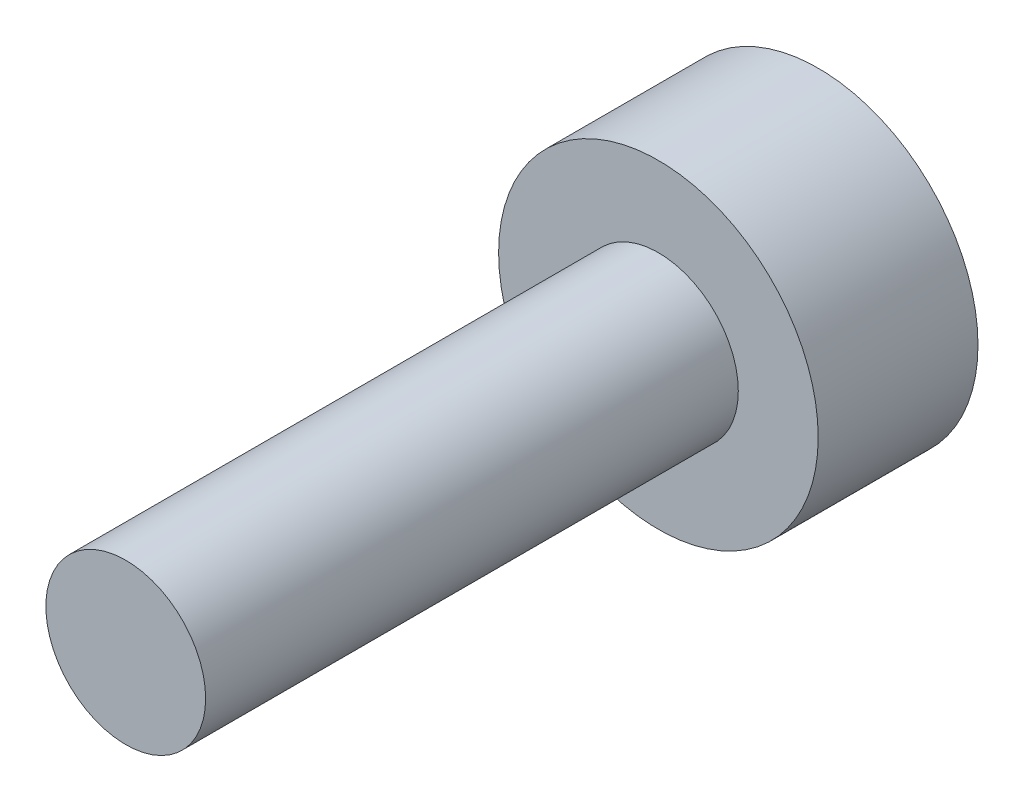
ISO-10303-21;
HEADER;
FILE_DESCRIPTION(('STEP AP214'),'2;1');
FILE_NAME('part.step','',(''),(''),'','','');
FILE_SCHEMA(('AUTOMOTIVE_DESIGN { 1 0 10303 214 1 1 1 1 }'));
ENDSEC;
DATA;
#1=APPLICATION_CONTEXT('core data for automotive mechanical design processes');
#2=APPLICATION_PROTOCOL_DEFINITION('international standard','automotive_design',2000,#1);
#3=PRODUCT_CONTEXT('',#1,'mechanical');
#4=PRODUCT('Part','Part','',(#3));
#5=PRODUCT_RELATED_PRODUCT_CATEGORY('part','',(#4));
#6=PRODUCT_DEFINITION_FORMATION('','',#4);
#7=PRODUCT_DEFINITION_CONTEXT('part definition',#1,'design');
#8=PRODUCT_DEFINITION('design','',#6,#7);
#9=PRODUCT_DEFINITION_SHAPE('','',#8);
#10=(LENGTH_UNIT() NAMED_UNIT(*) SI_UNIT(.MILLI.,.METRE.));
#11=(NAMED_UNIT(*) PLANE_ANGLE_UNIT() SI_UNIT($,.RADIAN.));
#12=(NAMED_UNIT(*) SI_UNIT($,.STERADIAN.) SOLID_ANGLE_UNIT());
#13=UNCERTAINTY_MEASURE_WITH_UNIT(LENGTH_MEASURE(1.E-05),#10,'distance_accuracy_value','');
#14=(GEOMETRIC_REPRESENTATION_CONTEXT(3) GLOBAL_UNCERTAINTY_ASSIGNED_CONTEXT((#13)) GLOBAL_UNIT_ASSIGNED_CONTEXT((#10,
#11,#12)) REPRESENTATION_CONTEXT('',''));
#15=CARTESIAN_POINT('',(0.,0.,0.));
#16=DIRECTION('',(0.,0.,1.));
#17=DIRECTION('',(1.,0.,0.));
#18=AXIS2_PLACEMENT_3D('',#15,#16,#17);
#19=CARTESIAN_POINT('',(-1.84950811302659,0.425595617246563,10.));
#20=DIRECTION('',(0.,0.,-1.));
#21=DIRECTION('',(-1.,0.,0.));
#22=AXIS2_PLACEMENT_3D('',#19,#20,#21);
#23=CYLINDRICAL_SURFACE('',#22,1.5);
#24=CARTESIAN_POINT('',(-1.84950811302659,0.425595617246563,10.));
#25=DIRECTION('',(0.,0.,1.));
#26=DIRECTION('',(1.,0.,0.));
#27=AXIS2_PLACEMENT_3D('',#24,#25,#26);
#28=CIRCLE('',#27,1.5);
#29=CARTESIAN_POINT('',(-0.349508113026588,0.425595617246563,10.));
#30=VERTEX_POINT('',#29);
#31=EDGE_CURVE('E10',#30,#30,#28,.T.);
#32=ORIENTED_EDGE('',*,*,#31,.F.);
#33=EDGE_LOOP('',(#32));
#34=FACE_BOUND('',#33,.T.);
#35=CARTESIAN_POINT('',(-1.84950811302659,0.425595617246563,0.));
#36=DIRECTION('',(0.,0.,1.));
#37=DIRECTION('',(1.,0.,0.));
#38=AXIS2_PLACEMENT_3D('',#35,#36,#37);
#39=CIRCLE('',#38,1.5);
#40=CARTESIAN_POINT('',(-0.349508113026588,0.425595617246563,0.));
#41=VERTEX_POINT('',#40);
#42=EDGE_CURVE('E44',#41,#41,#39,.T.);
#43=ORIENTED_EDGE('',*,*,#42,.T.);
#44=EDGE_LOOP('',(#43));
#45=FACE_BOUND('',#44,.T.);
#46=ADVANCED_FACE('F41',(#34,#45),#23,.T.);
#47=CARTESIAN_POINT('',(-1.84950811302659,0.425595617246563,10.));
#48=DIRECTION('',(0.,0.,1.));
#49=DIRECTION('',(1.,0.,0.));
#50=AXIS2_PLACEMENT_3D('',#47,#48,#49);
#51=PLANE('',#50);
#52=ORIENTED_EDGE('',*,*,#31,.T.);
#53=EDGE_LOOP('',(#52));
#54=FACE_BOUND('',#53,.T.);
#55=ADVANCED_FACE('F68',(#54),#51,.T.);
#56=CARTESIAN_POINT('',(-1.84950811302659,0.425595617246563,-3.));
#57=DIRECTION('',(0.,0.,1.));
#58=DIRECTION('',(1.,0.,0.));
#59=AXIS2_PLACEMENT_3D('',#56,#57,#58);
#60=CYLINDRICAL_SURFACE('',#59,3.);
#61=CARTESIAN_POINT('',(-1.84950811302659,0.425595617246563,-3.));
#62=DIRECTION('',(0.,0.,-1.));
#63=DIRECTION('',(-1.,0.,0.));
#64=AXIS2_PLACEMENT_3D('',#61,#62,#63);
#65=CIRCLE('',#64,3.);
#66=CARTESIAN_POINT('',(-4.84950811302659,0.425595617246563,-3.));
#67=VERTEX_POINT('',#66);
#68=EDGE_CURVE('E53',#67,#67,#65,.T.);
#69=ORIENTED_EDGE('',*,*,#68,.F.);
#70=EDGE_LOOP('',(#69));
#71=FACE_BOUND('',#70,.T.);
#72=CARTESIAN_POINT('',(-1.84950811302659,0.425595617246563,0.));
#73=DIRECTION('',(0.,0.,-1.));
#74=DIRECTION('',(-1.,0.,0.));
#75=AXIS2_PLACEMENT_3D('',#72,#73,#74);
#76=CIRCLE('',#75,3.);
#77=CARTESIAN_POINT('',(-4.84950811302659,0.425595617246563,0.));
#78=VERTEX_POINT('',#77);
#79=EDGE_CURVE('E55',#78,#78,#76,.T.);
#80=ORIENTED_EDGE('',*,*,#79,.T.);
#81=EDGE_LOOP('',(#80));
#82=FACE_BOUND('',#81,.T.);
#83=ADVANCED_FACE('F65',(#71,#82),#60,.T.);
#84=CARTESIAN_POINT('',(-1.84950811302659,0.425595617246563,-3.));
#85=DIRECTION('',(0.,0.,-1.));
#86=DIRECTION('',(-1.,0.,0.));
#87=AXIS2_PLACEMENT_3D('',#84,#85,#86);
#88=PLANE('',#87);
#89=ORIENTED_EDGE('',*,*,#68,.T.);
#90=EDGE_LOOP('',(#89));
#91=FACE_BOUND('',#90,.T.);
#92=ADVANCED_FACE('F63',(#91),#88,.T.);
#93=CARTESIAN_POINT('',(-1.84950811302659,0.425595617246563,0.));
#94=DIRECTION('',(0.,0.,-1.));
#95=DIRECTION('',(-1.,0.,0.));
#96=AXIS2_PLACEMENT_3D('',#93,#94,#95);
#97=PLANE('',#96);
#98=ORIENTED_EDGE('',*,*,#42,.F.);
#99=EDGE_LOOP('',(#98));
#100=FACE_BOUND('',#99,.T.);
#101=ORIENTED_EDGE('',*,*,#79,.F.);
#102=EDGE_LOOP('',(#101));
#103=FACE_BOUND('',#102,.T.);
#104=ADVANCED_FACE('F72',(#100,#103),#97,.F.);
#105=CLOSED_SHELL('',(#46,#55,#83,#92,#104));
#106=MANIFOLD_SOLID_BREP('B2',#105);
#107=ADVANCED_BREP_SHAPE_REPRESENTATION('',(#18,#106),#14);
#108=SHAPE_DEFINITION_REPRESENTATION(#9,#107);
ENDSEC;
END-ISO-10303-21;
